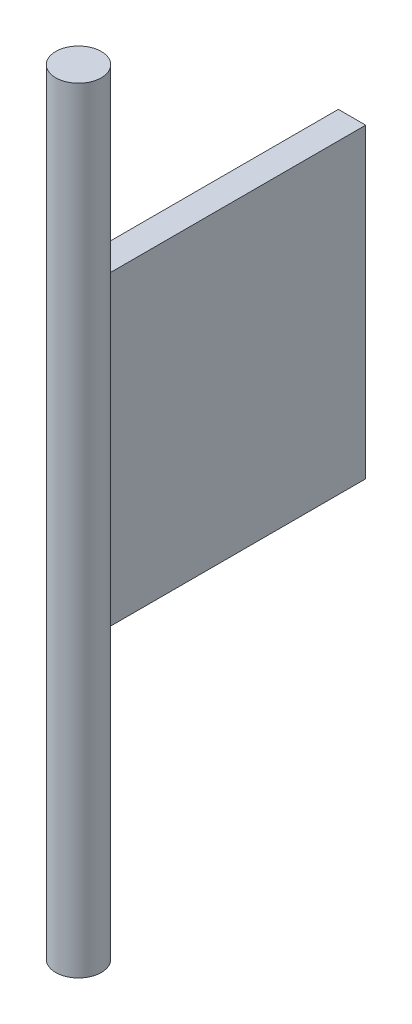
ISO-10303-21;
HEADER;
FILE_DESCRIPTION(('STEP AP214'),'2;1');
FILE_NAME('part.step','',(''),(''),'','','');
FILE_SCHEMA(('AUTOMOTIVE_DESIGN { 1 0 10303 214 1 1 1 1 }'));
ENDSEC;
DATA;
#1=APPLICATION_CONTEXT('core data for automotive mechanical design processes');
#2=APPLICATION_PROTOCOL_DEFINITION('international standard','automotive_design',2000,#1);
#3=PRODUCT_CONTEXT('',#1,'mechanical');
#4=PRODUCT('Part','Part','',(#3));
#5=PRODUCT_RELATED_PRODUCT_CATEGORY('part','',(#4));
#6=PRODUCT_DEFINITION_FORMATION('','',#4);
#7=PRODUCT_DEFINITION_CONTEXT('part definition',#1,'design');
#8=PRODUCT_DEFINITION('design','',#6,#7);
#9=PRODUCT_DEFINITION_SHAPE('','',#8);
#10=(LENGTH_UNIT() NAMED_UNIT(*) SI_UNIT(.MILLI.,.METRE.));
#11=(NAMED_UNIT(*) PLANE_ANGLE_UNIT() SI_UNIT($,.RADIAN.));
#12=(NAMED_UNIT(*) SI_UNIT($,.STERADIAN.) SOLID_ANGLE_UNIT());
#13=UNCERTAINTY_MEASURE_WITH_UNIT(LENGTH_MEASURE(1.E-05),#10,'distance_accuracy_value','');
#14=(GEOMETRIC_REPRESENTATION_CONTEXT(3) GLOBAL_UNCERTAINTY_ASSIGNED_CONTEXT((#13)) GLOBAL_UNIT_ASSIGNED_CONTEXT((#10,
#11,#12)) REPRESENTATION_CONTEXT('',''));
#15=CARTESIAN_POINT('',(0.,0.,0.));
#16=DIRECTION('',(0.,0.,1.));
#17=DIRECTION('',(1.,0.,0.));
#18=AXIS2_PLACEMENT_3D('',#15,#16,#17);
#19=CARTESIAN_POINT('',(3.,0.,0.));
#20=DIRECTION('',(1.,0.,0.));
#21=DIRECTION('',(0.,0.,-1.));
#22=AXIS2_PLACEMENT_3D('',#19,#20,#21);
#23=PLANE('',#22);
#24=DIRECTION('',(0.,0.,1.));
#25=VECTOR('',#24,1.);
#26=CARTESIAN_POINT('',(3.,16.8,15.));
#27=LINE('',#26,#25);
#28=CARTESIAN_POINT('',(3.,16.8,-15.));
#29=VERTEX_POINT('',#28);
#30=CARTESIAN_POINT('',(3.,16.8,13.));
#31=VERTEX_POINT('',#30);
#32=EDGE_CURVE('E99',#29,#31,#27,.T.);
#33=ORIENTED_EDGE('',*,*,#32,.T.);
#34=DIRECTION('',(0.,-1.,0.));
#35=VECTOR('',#34,1.);
#36=CARTESIAN_POINT('',(3.,36.8,13.));
#37=LINE('',#36,#35);
#38=CARTESIAN_POINT('',(3.,-16.8,13.));
#39=VERTEX_POINT('',#38);
#40=EDGE_CURVE('E47',#31,#39,#37,.T.);
#41=ORIENTED_EDGE('',*,*,#40,.T.);
#42=DIRECTION('',(0.,0.,-1.));
#43=VECTOR('',#42,1.);
#44=CARTESIAN_POINT('',(3.,-16.8,15.));
#45=LINE('',#44,#43);
#46=CARTESIAN_POINT('',(3.,-16.8,-15.));
#47=VERTEX_POINT('',#46);
#48=EDGE_CURVE('E87',#39,#47,#45,.T.);
#49=ORIENTED_EDGE('',*,*,#48,.T.);
#50=DIRECTION('',(0.,1.,0.));
#51=VECTOR('',#50,1.);
#52=CARTESIAN_POINT('',(3.,16.8,-15.));
#53=LINE('',#52,#51);
#54=EDGE_CURVE('E81',#47,#29,#53,.T.);
#55=ORIENTED_EDGE('',*,*,#54,.T.);
#56=EDGE_LOOP('',(#33,#41,#49,#55));
#57=FACE_BOUND('',#56,.T.);
#58=ADVANCED_FACE('F32',(#57),#23,.T.);
#59=CARTESIAN_POINT('',(0.,0.,0.));
#60=DIRECTION('',(1.,0.,0.));
#61=DIRECTION('',(0.,0.,-1.));
#62=AXIS2_PLACEMENT_3D('',#59,#60,#61);
#63=PLANE('',#62);
#64=DIRECTION('',(0.,-1.,0.));
#65=VECTOR('',#64,1.);
#66=CARTESIAN_POINT('',(0.,36.8,13.));
#67=LINE('',#66,#65);
#68=CARTESIAN_POINT('',(0.,16.8,13.));
#69=VERTEX_POINT('',#68);
#70=CARTESIAN_POINT('',(0.,-16.8,13.));
#71=VERTEX_POINT('',#70);
#72=EDGE_CURVE('E11',#69,#71,#67,.T.);
#73=ORIENTED_EDGE('',*,*,#72,.F.);
#74=DIRECTION('',(0.,0.,1.));
#75=VECTOR('',#74,1.);
#76=CARTESIAN_POINT('',(0.,16.8,15.));
#77=LINE('',#76,#75);
#78=CARTESIAN_POINT('',(0.,16.8,-15.));
#79=VERTEX_POINT('',#78);
#80=EDGE_CURVE('E82',#79,#69,#77,.T.);
#81=ORIENTED_EDGE('',*,*,#80,.F.);
#82=DIRECTION('',(0.,1.,0.));
#83=VECTOR('',#82,1.);
#84=CARTESIAN_POINT('',(0.,16.8,-15.));
#85=LINE('',#84,#83);
#86=CARTESIAN_POINT('',(0.,-16.8,-15.));
#87=VERTEX_POINT('',#86);
#88=EDGE_CURVE('E77',#87,#79,#85,.T.);
#89=ORIENTED_EDGE('',*,*,#88,.F.);
#90=DIRECTION('',(0.,0.,-1.));
#91=VECTOR('',#90,1.);
#92=CARTESIAN_POINT('',(0.,-16.8,15.));
#93=LINE('',#92,#91);
#94=EDGE_CURVE('E73',#71,#87,#93,.T.);
#95=ORIENTED_EDGE('',*,*,#94,.F.);
#96=EDGE_LOOP('',(#73,#81,#89,#95));
#97=FACE_BOUND('',#96,.T.);
#98=ADVANCED_FACE('F75',(#97),#63,.F.);
#99=CARTESIAN_POINT('',(3.,16.8,-15.));
#100=DIRECTION('',(0.,0.,1.));
#101=DIRECTION('',(0.,-1.,0.));
#102=AXIS2_PLACEMENT_3D('',#99,#100,#101);
#103=PLANE('',#102);
#104=ORIENTED_EDGE('',*,*,#88,.T.);
#105=DIRECTION('',(-1.,0.,0.));
#106=VECTOR('',#105,1.);
#107=CARTESIAN_POINT('',(3.,16.8,-15.));
#108=LINE('',#107,#106);
#109=EDGE_CURVE('E40',#29,#79,#108,.T.);
#110=ORIENTED_EDGE('',*,*,#109,.F.);
#111=ORIENTED_EDGE('',*,*,#54,.F.);
#112=DIRECTION('',(-1.,0.,0.));
#113=VECTOR('',#112,1.);
#114=CARTESIAN_POINT('',(3.,-16.8,-15.));
#115=LINE('',#114,#113);
#116=EDGE_CURVE('E102',#47,#87,#115,.T.);
#117=ORIENTED_EDGE('',*,*,#116,.T.);
#118=EDGE_LOOP('',(#104,#110,#111,#117));
#119=FACE_BOUND('',#118,.T.);
#120=ADVANCED_FACE('F34',(#119),#103,.F.);
#121=CARTESIAN_POINT('',(3.,16.8,15.));
#122=DIRECTION('',(0.,-1.,0.));
#123=DIRECTION('',(0.,0.,-1.));
#124=AXIS2_PLACEMENT_3D('',#121,#122,#123);
#125=PLANE('',#124);
#126=CARTESIAN_POINT('',(1.5,16.8,15.));
#127=DIRECTION('',(0.,-1.,0.));
#128=DIRECTION('',(0.,0.,-1.));
#129=AXIS2_PLACEMENT_3D('',#126,#127,#128);
#130=CIRCLE('',#129,2.5);
#131=EDGE_CURVE('E55',#31,#69,#130,.F.);
#132=ORIENTED_EDGE('',*,*,#131,.F.);
#133=ORIENTED_EDGE('',*,*,#32,.F.);
#134=ORIENTED_EDGE('',*,*,#109,.T.);
#135=ORIENTED_EDGE('',*,*,#80,.T.);
#136=EDGE_LOOP('',(#132,#133,#134,#135));
#137=FACE_BOUND('',#136,.T.);
#138=ADVANCED_FACE('F107',(#137),#125,.F.);
#139=CARTESIAN_POINT('',(3.,-16.8,15.));
#140=DIRECTION('',(0.,1.,0.));
#141=DIRECTION('',(0.,0.,1.));
#142=AXIS2_PLACEMENT_3D('',#139,#140,#141);
#143=PLANE('',#142);
#144=CARTESIAN_POINT('',(1.5,-16.8,15.));
#145=DIRECTION('',(0.,1.,0.));
#146=DIRECTION('',(0.,0.,1.));
#147=AXIS2_PLACEMENT_3D('',#144,#145,#146);
#148=CIRCLE('',#147,2.5);
#149=EDGE_CURVE('E85',#71,#39,#148,.F.);
#150=ORIENTED_EDGE('',*,*,#149,.F.);
#151=ORIENTED_EDGE('',*,*,#94,.T.);
#152=ORIENTED_EDGE('',*,*,#116,.F.);
#153=ORIENTED_EDGE('',*,*,#48,.F.);
#154=EDGE_LOOP('',(#150,#151,#152,#153));
#155=FACE_BOUND('',#154,.T.);
#156=ADVANCED_FACE('F86',(#155),#143,.F.);
#157=CARTESIAN_POINT('',(1.5,36.8,15.));
#158=DIRECTION('',(0.,-1.,0.));
#159=DIRECTION('',(0.,0.,-1.));
#160=AXIS2_PLACEMENT_3D('',#157,#158,#159);
#161=CYLINDRICAL_SURFACE('',#160,2.5);
#162=ORIENTED_EDGE('',*,*,#40,.F.);
#163=ORIENTED_EDGE('',*,*,#131,.T.);
#164=ORIENTED_EDGE('',*,*,#72,.T.);
#165=ORIENTED_EDGE('',*,*,#149,.T.);
#166=EDGE_LOOP('',(#162,#163,#164,#165));
#167=FACE_BOUND('',#166,.T.);
#168=CARTESIAN_POINT('',(1.5,36.8,15.));
#169=DIRECTION('',(0.,1.,0.));
#170=DIRECTION('',(0.,0.,1.));
#171=AXIS2_PLACEMENT_3D('',#168,#169,#170);
#172=CIRCLE('',#171,2.5);
#173=CARTESIAN_POINT('',(1.5,36.8,17.5));
#174=VERTEX_POINT('',#173);
#175=EDGE_CURVE('E89',#174,#174,#172,.T.);
#176=ORIENTED_EDGE('',*,*,#175,.F.);
#177=EDGE_LOOP('',(#176));
#178=FACE_BOUND('',#177,.T.);
#179=CARTESIAN_POINT('',(1.5,-48.2,15.));
#180=DIRECTION('',(0.,1.,0.));
#181=DIRECTION('',(0.,0.,1.));
#182=AXIS2_PLACEMENT_3D('',#179,#180,#181);
#183=CIRCLE('',#182,2.5);
#184=CARTESIAN_POINT('',(1.5,-48.2,17.5));
#185=VERTEX_POINT('',#184);
#186=EDGE_CURVE('E174',#185,#185,#183,.T.);
#187=ORIENTED_EDGE('',*,*,#186,.T.);
#188=EDGE_LOOP('',(#187));
#189=FACE_BOUND('',#188,.T.);
#190=ADVANCED_FACE('F91',(#167,#178,#189),#161,.T.);
#191=CARTESIAN_POINT('',(1.5,36.8,15.));
#192=DIRECTION('',(0.,1.,0.));
#193=DIRECTION('',(0.,0.,1.));
#194=AXIS2_PLACEMENT_3D('',#191,#192,#193);
#195=PLANE('',#194);
#196=ORIENTED_EDGE('',*,*,#175,.T.);
#197=EDGE_LOOP('',(#196));
#198=FACE_BOUND('',#197,.T.);
#199=ADVANCED_FACE('F151',(#198),#195,.T.);
#200=CARTESIAN_POINT('',(1.5,-48.2,15.));
#201=DIRECTION('',(0.,1.,0.));
#202=DIRECTION('',(0.,0.,1.));
#203=AXIS2_PLACEMENT_3D('',#200,#201,#202);
#204=PLANE('',#203);
#205=ORIENTED_EDGE('',*,*,#186,.F.);
#206=EDGE_LOOP('',(#205));
#207=FACE_BOUND('',#206,.T.);
#208=ADVANCED_FACE('F159',(#207),#204,.F.);
#209=CLOSED_SHELL('',(#58,#98,#120,#138,#156,#190,#199,#208));
#210=MANIFOLD_SOLID_BREP('B2',#209);
#211=ADVANCED_BREP_SHAPE_REPRESENTATION('',(#18,#210),#14);
#212=SHAPE_DEFINITION_REPRESENTATION(#9,#211);
ENDSEC;
END-ISO-10303-21;
